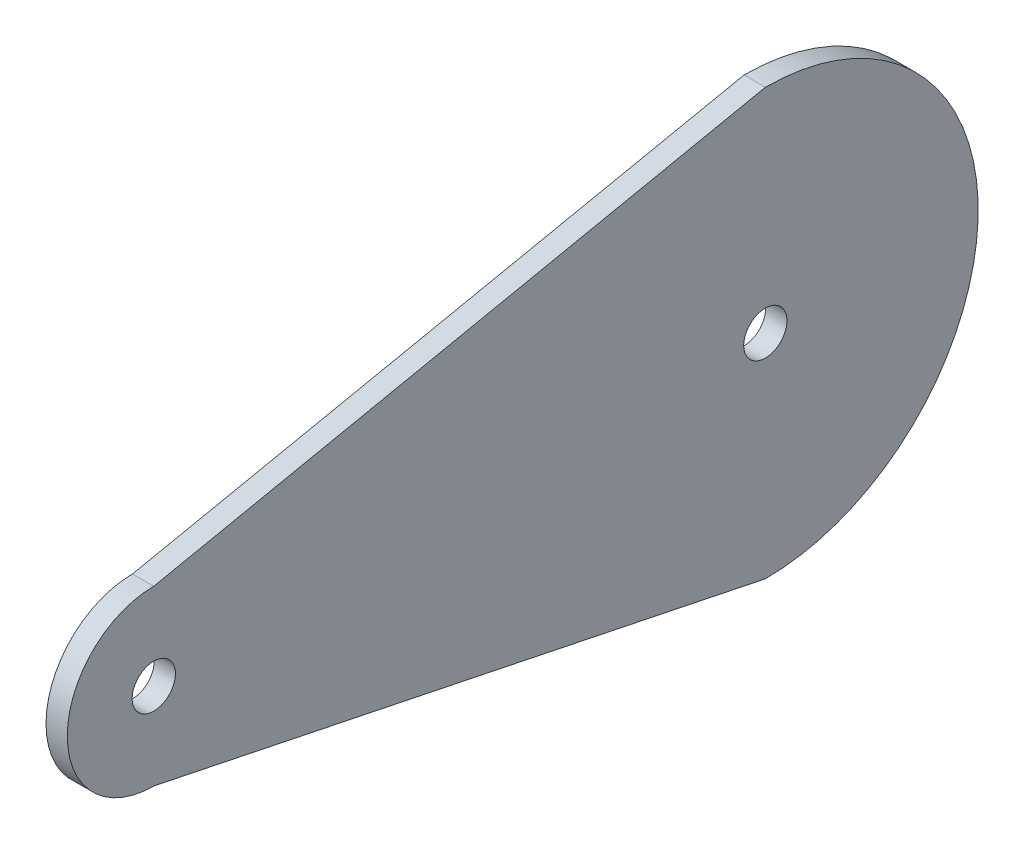
ISO-10303-21;
HEADER;
FILE_DESCRIPTION(('STEP AP214'),'2;1');
FILE_NAME('part.step','',(''),(''),'','','');
FILE_SCHEMA(('AUTOMOTIVE_DESIGN { 1 0 10303 214 1 1 1 1 }'));
ENDSEC;
DATA;
#1=APPLICATION_CONTEXT('core data for automotive mechanical design processes');
#2=APPLICATION_PROTOCOL_DEFINITION('international standard','automotive_design',2000,#1);
#3=PRODUCT_CONTEXT('',#1,'mechanical');
#4=PRODUCT('Part','Part','',(#3));
#5=PRODUCT_RELATED_PRODUCT_CATEGORY('part','',(#4));
#6=PRODUCT_DEFINITION_FORMATION('','',#4);
#7=PRODUCT_DEFINITION_CONTEXT('part definition',#1,'design');
#8=PRODUCT_DEFINITION('design','',#6,#7);
#9=PRODUCT_DEFINITION_SHAPE('','',#8);
#10=(LENGTH_UNIT() NAMED_UNIT(*) SI_UNIT(.MILLI.,.METRE.));
#11=(NAMED_UNIT(*) PLANE_ANGLE_UNIT() SI_UNIT($,.RADIAN.));
#12=(NAMED_UNIT(*) SI_UNIT($,.STERADIAN.) SOLID_ANGLE_UNIT());
#13=UNCERTAINTY_MEASURE_WITH_UNIT(LENGTH_MEASURE(1.E-05),#10,'distance_accuracy_value','');
#14=(GEOMETRIC_REPRESENTATION_CONTEXT(3) GLOBAL_UNCERTAINTY_ASSIGNED_CONTEXT((#13)) GLOBAL_UNIT_ASSIGNED_CONTEXT((#10,
#11,#12)) REPRESENTATION_CONTEXT('',''));
#15=CARTESIAN_POINT('',(0.,0.,0.));
#16=DIRECTION('',(0.,0.,1.));
#17=DIRECTION('',(1.,0.,0.));
#18=AXIS2_PLACEMENT_3D('',#15,#16,#17);
#19=CARTESIAN_POINT('',(2.54,-9.90068513488219,2.04551349423278));
#20=DIRECTION('',(0.,0.979317373878997,-0.202330129290586));
#21=DIRECTION('',(0.,0.202330129290586,0.979317373878997));
#22=AXIS2_PLACEMENT_3D('',#19,#20,#21);
#23=PLANE('',#22);
#24=DIRECTION('',(0.,-0.202330129290586,-0.979317373878997));
#25=VECTOR('',#24,1.);
#26=CARTESIAN_POINT('',(0.,-9.90068513488219,2.04551349423278));
#27=LINE('',#26,#25);
#28=CARTESIAN_POINT('',(0.,-10.3232948228064,0.));
#29=VERTEX_POINT('',#28);
#30=CARTESIAN_POINT('',(0.,-25.4,-72.9742));
#31=VERTEX_POINT('',#30);
#32=EDGE_CURVE('E106',#29,#31,#27,.T.);
#33=ORIENTED_EDGE('',*,*,#32,.T.);
#34=DIRECTION('',(-1.,0.,0.));
#35=VECTOR('',#34,1.);
#36=CARTESIAN_POINT('',(2.54,-25.4,-72.9742));
#37=LINE('',#36,#35);
#38=CARTESIAN_POINT('',(2.54,-25.4,-72.9742));
#39=VERTEX_POINT('',#38);
#40=EDGE_CURVE('E11',#39,#31,#37,.T.);
#41=ORIENTED_EDGE('',*,*,#40,.F.);
#42=DIRECTION('',(0.,-0.202330129290586,-0.979317373878997));
#43=VECTOR('',#42,1.);
#44=CARTESIAN_POINT('',(2.54,-9.90068513488219,2.04551349423278));
#45=LINE('',#44,#43);
#46=CARTESIAN_POINT('',(2.54,-10.3232948228064,0.));
#47=VERTEX_POINT('',#46);
#48=EDGE_CURVE('E85',#47,#39,#45,.T.);
#49=ORIENTED_EDGE('',*,*,#48,.F.);
#50=DIRECTION('',(-1.,0.,0.));
#51=VECTOR('',#50,1.);
#52=CARTESIAN_POINT('',(2.54,-10.3232948228064,0.));
#53=LINE('',#52,#51);
#54=EDGE_CURVE('E105',#47,#29,#53,.T.);
#55=ORIENTED_EDGE('',*,*,#54,.T.);
#56=EDGE_LOOP('',(#33,#41,#49,#55));
#57=FACE_BOUND('',#56,.T.);
#58=ADVANCED_FACE('F37',(#57),#23,.F.);
#59=CARTESIAN_POINT('',(2.54,0.,-72.9742));
#60=DIRECTION('',(-1.,0.,0.));
#61=DIRECTION('',(0.,0.,1.));
#62=AXIS2_PLACEMENT_3D('',#59,#60,#61);
#63=CYLINDRICAL_SURFACE('',#62,25.4);
#64=CARTESIAN_POINT('',(0.,0.,-72.9742));
#65=DIRECTION('',(1.,0.,0.));
#66=DIRECTION('',(0.,0.,-1.));
#67=AXIS2_PLACEMENT_3D('',#64,#65,#66);
#68=CIRCLE('',#67,25.4);
#69=CARTESIAN_POINT('',(0.,25.4,-72.9742));
#70=VERTEX_POINT('',#69);
#71=EDGE_CURVE('E90',#31,#70,#68,.T.);
#72=ORIENTED_EDGE('',*,*,#71,.T.);
#73=DIRECTION('',(-1.,0.,0.));
#74=VECTOR('',#73,1.);
#75=CARTESIAN_POINT('',(2.54,25.4,-72.9742));
#76=LINE('',#75,#74);
#77=CARTESIAN_POINT('',(2.54,25.4,-72.9742));
#78=VERTEX_POINT('',#77);
#79=EDGE_CURVE('E45',#78,#70,#76,.T.);
#80=ORIENTED_EDGE('',*,*,#79,.F.);
#81=CARTESIAN_POINT('',(2.54,0.,-72.9742));
#82=DIRECTION('',(1.,0.,0.));
#83=DIRECTION('',(0.,0.,-1.));
#84=AXIS2_PLACEMENT_3D('',#81,#82,#83);
#85=CIRCLE('',#84,25.4);
#86=EDGE_CURVE('E79',#39,#78,#85,.T.);
#87=ORIENTED_EDGE('',*,*,#86,.F.);
#88=ORIENTED_EDGE('',*,*,#40,.T.);
#89=EDGE_LOOP('',(#72,#80,#87,#88));
#90=FACE_BOUND('',#89,.T.);
#91=ADVANCED_FACE('F89',(#90),#63,.T.);
#92=CARTESIAN_POINT('',(2.54,9.90068513488219,2.04551349423278));
#93=DIRECTION('',(0.,0.979317373878997,0.202330129290586));
#94=DIRECTION('',(0.,-0.202330129290586,0.979317373878997));
#95=AXIS2_PLACEMENT_3D('',#92,#93,#94);
#96=PLANE('',#95);
#97=DIRECTION('',(0.,0.202330129290586,-0.979317373878997));
#98=VECTOR('',#97,1.);
#99=CARTESIAN_POINT('',(0.,9.90068513488219,2.04551349423278));
#100=LINE('',#99,#98);
#101=CARTESIAN_POINT('',(0.,10.3232948228064,0.));
#102=VERTEX_POINT('',#101);
#103=EDGE_CURVE('E110',#102,#70,#100,.T.);
#104=ORIENTED_EDGE('',*,*,#103,.F.);
#105=DIRECTION('',(-1.,0.,0.));
#106=VECTOR('',#105,1.);
#107=CARTESIAN_POINT('',(2.54,10.3232948228064,0.));
#108=LINE('',#107,#106);
#109=CARTESIAN_POINT('',(2.54,10.3232948228064,0.));
#110=VERTEX_POINT('',#109);
#111=EDGE_CURVE('E69',#110,#102,#108,.T.);
#112=ORIENTED_EDGE('',*,*,#111,.F.);
#113=DIRECTION('',(0.,0.202330129290586,-0.979317373878997));
#114=VECTOR('',#113,1.);
#115=CARTESIAN_POINT('',(2.54,9.90068513488219,2.04551349423278));
#116=LINE('',#115,#114);
#117=EDGE_CURVE('E83',#110,#78,#116,.T.);
#118=ORIENTED_EDGE('',*,*,#117,.T.);
#119=ORIENTED_EDGE('',*,*,#79,.T.);
#120=EDGE_LOOP('',(#104,#112,#118,#119));
#121=FACE_BOUND('',#120,.T.);
#122=ADVANCED_FACE('F94',(#121),#96,.T.);
#123=CARTESIAN_POINT('',(2.54,0.,0.));
#124=DIRECTION('',(-1.,0.,0.));
#125=DIRECTION('',(0.,0.,1.));
#126=AXIS2_PLACEMENT_3D('',#123,#124,#125);
#127=CYLINDRICAL_SURFACE('',#126,2.5808237057016);
#128=CARTESIAN_POINT('',(2.54,0.,0.));
#129=DIRECTION('',(1.,0.,0.));
#130=DIRECTION('',(0.,0.,-1.));
#131=AXIS2_PLACEMENT_3D('',#128,#129,#130);
#132=CIRCLE('',#131,2.5808237057016);
#133=CARTESIAN_POINT('',(2.54,0.,-2.5808237057016));
#134=VERTEX_POINT('',#133);
#135=EDGE_CURVE('E96',#134,#134,#132,.T.);
#136=ORIENTED_EDGE('',*,*,#135,.T.);
#137=EDGE_LOOP('',(#136));
#138=FACE_BOUND('',#137,.T.);
#139=CARTESIAN_POINT('',(0.,0.,0.));
#140=DIRECTION('',(1.,0.,0.));
#141=DIRECTION('',(0.,0.,-1.));
#142=AXIS2_PLACEMENT_3D('',#139,#140,#141);
#143=CIRCLE('',#142,2.5808237057016);
#144=CARTESIAN_POINT('',(0.,0.,-2.5808237057016));
#145=VERTEX_POINT('',#144);
#146=EDGE_CURVE('E113',#145,#145,#143,.T.);
#147=ORIENTED_EDGE('',*,*,#146,.F.);
#148=EDGE_LOOP('',(#147));
#149=FACE_BOUND('',#148,.T.);
#150=ADVANCED_FACE('F141',(#138,#149),#127,.F.);
#151=CARTESIAN_POINT('',(2.54,0.,0.));
#152=DIRECTION('',(-1.,0.,0.));
#153=DIRECTION('',(0.,0.,1.));
#154=AXIS2_PLACEMENT_3D('',#151,#152,#153);
#155=CYLINDRICAL_SURFACE('',#154,10.3232948228064);
#156=CARTESIAN_POINT('',(0.,0.,0.));
#157=DIRECTION('',(1.,0.,0.));
#158=DIRECTION('',(0.,0.,-1.));
#159=AXIS2_PLACEMENT_3D('',#156,#157,#158);
#160=CIRCLE('',#159,10.3232948228064);
#161=EDGE_CURVE('E72',#102,#29,#160,.T.);
#162=ORIENTED_EDGE('',*,*,#161,.T.);
#163=ORIENTED_EDGE('',*,*,#54,.F.);
#164=CARTESIAN_POINT('',(2.54,0.,0.));
#165=DIRECTION('',(1.,0.,0.));
#166=DIRECTION('',(0.,0.,-1.));
#167=AXIS2_PLACEMENT_3D('',#164,#165,#166);
#168=CIRCLE('',#167,10.3232948228064);
#169=EDGE_CURVE('E53',#110,#47,#168,.T.);
#170=ORIENTED_EDGE('',*,*,#169,.F.);
#171=ORIENTED_EDGE('',*,*,#111,.T.);
#172=EDGE_LOOP('',(#162,#163,#170,#171));
#173=FACE_BOUND('',#172,.T.);
#174=ADVANCED_FACE('F133',(#173),#155,.T.);
#175=CARTESIAN_POINT('',(2.54,0.,-72.9742));
#176=DIRECTION('',(-1.,0.,0.));
#177=DIRECTION('',(0.,0.,1.));
#178=AXIS2_PLACEMENT_3D('',#175,#176,#177);
#179=CYLINDRICAL_SURFACE('',#178,2.58082370570159);
#180=CARTESIAN_POINT('',(2.54,0.,-72.9742));
#181=DIRECTION('',(1.,0.,0.));
#182=DIRECTION('',(0.,0.,-1.));
#183=AXIS2_PLACEMENT_3D('',#180,#181,#182);
#184=CIRCLE('',#183,2.58082370570159);
#185=CARTESIAN_POINT('',(2.54,0.,-75.5550237057016));
#186=VERTEX_POINT('',#185);
#187=EDGE_CURVE('E102',#186,#186,#184,.T.);
#188=ORIENTED_EDGE('',*,*,#187,.T.);
#189=EDGE_LOOP('',(#188));
#190=FACE_BOUND('',#189,.T.);
#191=CARTESIAN_POINT('',(0.,0.,-72.9742));
#192=DIRECTION('',(1.,0.,0.));
#193=DIRECTION('',(0.,0.,-1.));
#194=AXIS2_PLACEMENT_3D('',#191,#192,#193);
#195=CIRCLE('',#194,2.58082370570159);
#196=CARTESIAN_POINT('',(0.,0.,-75.5550237057016));
#197=VERTEX_POINT('',#196);
#198=EDGE_CURVE('E116',#197,#197,#195,.T.);
#199=ORIENTED_EDGE('',*,*,#198,.F.);
#200=EDGE_LOOP('',(#199));
#201=FACE_BOUND('',#200,.T.);
#202=ADVANCED_FACE('F131',(#190,#201),#179,.F.);
#203=CARTESIAN_POINT('',(2.54,0.,0.));
#204=DIRECTION('',(1.,0.,0.));
#205=DIRECTION('',(0.,0.,-1.));
#206=AXIS2_PLACEMENT_3D('',#203,#204,#205);
#207=PLANE('',#206);
#208=ORIENTED_EDGE('',*,*,#48,.T.);
#209=ORIENTED_EDGE('',*,*,#86,.T.);
#210=ORIENTED_EDGE('',*,*,#117,.F.);
#211=ORIENTED_EDGE('',*,*,#169,.T.);
#212=EDGE_LOOP('',(#208,#209,#210,#211));
#213=FACE_BOUND('',#212,.T.);
#214=ORIENTED_EDGE('',*,*,#135,.F.);
#215=EDGE_LOOP('',(#214));
#216=FACE_BOUND('',#215,.T.);
#217=ORIENTED_EDGE('',*,*,#187,.F.);
#218=EDGE_LOOP('',(#217));
#219=FACE_BOUND('',#218,.T.);
#220=ADVANCED_FACE('F80',(#213,#216,#219),#207,.T.);
#221=CARTESIAN_POINT('',(0.,0.,0.));
#222=DIRECTION('',(1.,0.,0.));
#223=DIRECTION('',(0.,0.,-1.));
#224=AXIS2_PLACEMENT_3D('',#221,#222,#223);
#225=PLANE('',#224);
#226=ORIENTED_EDGE('',*,*,#32,.F.);
#227=ORIENTED_EDGE('',*,*,#161,.F.);
#228=ORIENTED_EDGE('',*,*,#103,.T.);
#229=ORIENTED_EDGE('',*,*,#71,.F.);
#230=EDGE_LOOP('',(#226,#227,#228,#229));
#231=FACE_BOUND('',#230,.T.);
#232=ORIENTED_EDGE('',*,*,#146,.T.);
#233=EDGE_LOOP('',(#232));
#234=FACE_BOUND('',#233,.T.);
#235=ORIENTED_EDGE('',*,*,#198,.T.);
#236=EDGE_LOOP('',(#235));
#237=FACE_BOUND('',#236,.T.);
#238=ADVANCED_FACE('F123',(#231,#234,#237),#225,.F.);
#239=CLOSED_SHELL('',(#58,#91,#122,#150,#174,#202,#220,#238));
#240=MANIFOLD_SOLID_BREP('B2',#239);
#241=ADVANCED_BREP_SHAPE_REPRESENTATION('',(#18,#240),#14);
#242=SHAPE_DEFINITION_REPRESENTATION(#9,#241);
ENDSEC;
END-ISO-10303-21;
